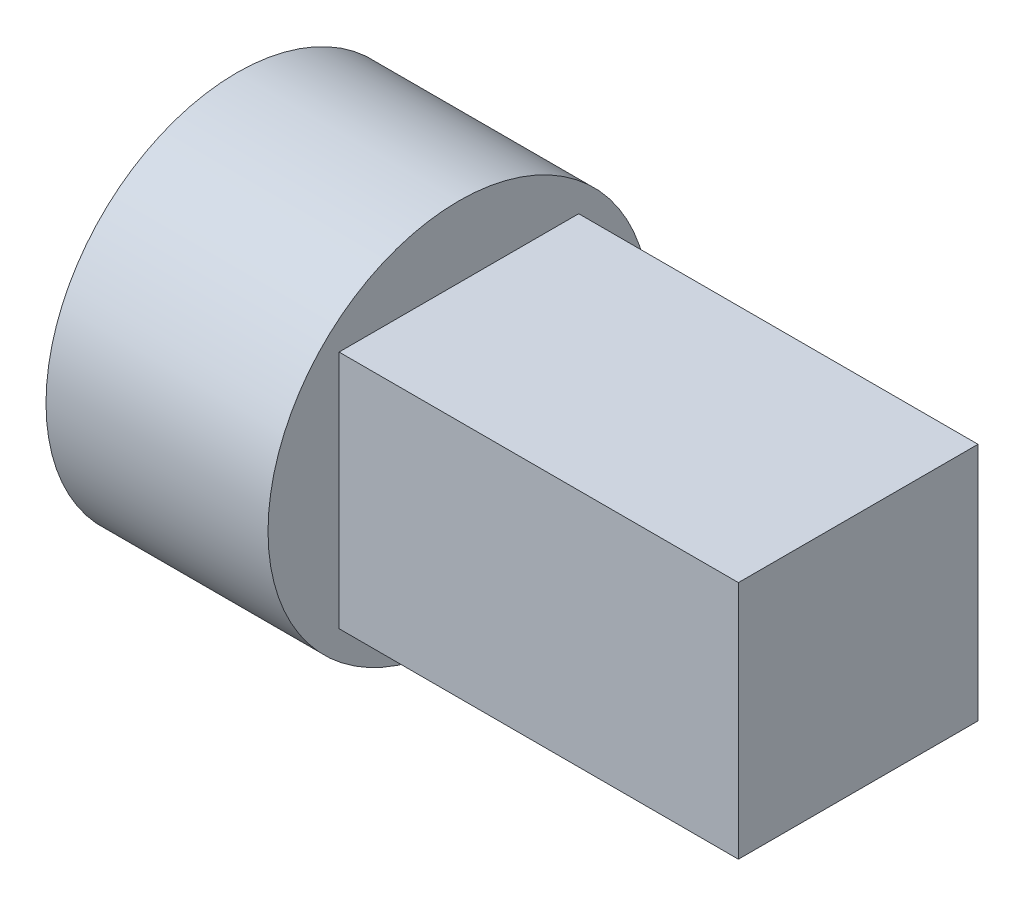
ISO-10303-21;
HEADER;
FILE_DESCRIPTION(('STEP AP214'),'2;1');
FILE_NAME('part.step','',(''),(''),'','','');
FILE_SCHEMA(('AUTOMOTIVE_DESIGN { 1 0 10303 214 1 1 1 1 }'));
ENDSEC;
DATA;
#1=APPLICATION_CONTEXT('core data for automotive mechanical design processes');
#2=APPLICATION_PROTOCOL_DEFINITION('international standard','automotive_design',2000,#1);
#3=PRODUCT_CONTEXT('',#1,'mechanical');
#4=PRODUCT('Part','Part','',(#3));
#5=PRODUCT_RELATED_PRODUCT_CATEGORY('part','',(#4));
#6=PRODUCT_DEFINITION_FORMATION('','',#4);
#7=PRODUCT_DEFINITION_CONTEXT('part definition',#1,'design');
#8=PRODUCT_DEFINITION('design','',#6,#7);
#9=PRODUCT_DEFINITION_SHAPE('','',#8);
#10=(LENGTH_UNIT() NAMED_UNIT(*) SI_UNIT(.MILLI.,.METRE.));
#11=(NAMED_UNIT(*) PLANE_ANGLE_UNIT() SI_UNIT($,.RADIAN.));
#12=(NAMED_UNIT(*) SI_UNIT($,.STERADIAN.) SOLID_ANGLE_UNIT());
#13=UNCERTAINTY_MEASURE_WITH_UNIT(LENGTH_MEASURE(1.E-05),#10,'distance_accuracy_value','');
#14=(GEOMETRIC_REPRESENTATION_CONTEXT(3) GLOBAL_UNCERTAINTY_ASSIGNED_CONTEXT((#13)) GLOBAL_UNIT_ASSIGNED_CONTEXT((#10,
#11,#12)) REPRESENTATION_CONTEXT('',''));
#15=CARTESIAN_POINT('',(0.,0.,0.));
#16=DIRECTION('',(0.,0.,1.));
#17=DIRECTION('',(1.,0.,0.));
#18=AXIS2_PLACEMENT_3D('',#15,#16,#17);
#19=CARTESIAN_POINT('',(2.78,0.,0.));
#20=DIRECTION('',(-1.,0.,0.));
#21=DIRECTION('',(0.,0.,1.));
#22=AXIS2_PLACEMENT_3D('',#19,#20,#21);
#23=CYLINDRICAL_SURFACE('',#22,4.78);
#24=CARTESIAN_POINT('',(2.78,0.,0.));
#25=DIRECTION('',(1.,0.,0.));
#26=DIRECTION('',(0.,0.,-1.));
#27=AXIS2_PLACEMENT_3D('',#24,#25,#26);
#28=CIRCLE('',#27,4.78);
#29=CARTESIAN_POINT('',(2.78,0.,-4.78));
#30=VERTEX_POINT('',#29);
#31=EDGE_CURVE('E11',#30,#30,#28,.T.);
#32=ORIENTED_EDGE('',*,*,#31,.F.);
#33=EDGE_LOOP('',(#32));
#34=FACE_BOUND('',#33,.T.);
#35=CARTESIAN_POINT('',(-2.78,0.,0.));
#36=DIRECTION('',(1.,0.,0.));
#37=DIRECTION('',(0.,0.,-1.));
#38=AXIS2_PLACEMENT_3D('',#35,#36,#37);
#39=CIRCLE('',#38,4.78);
#40=CARTESIAN_POINT('',(-2.78,0.,-4.78));
#41=VERTEX_POINT('',#40);
#42=EDGE_CURVE('E36',#41,#41,#39,.T.);
#43=ORIENTED_EDGE('',*,*,#42,.T.);
#44=EDGE_LOOP('',(#43));
#45=FACE_BOUND('',#44,.T.);
#46=ADVANCED_FACE('F33',(#34,#45),#23,.T.);
#47=CARTESIAN_POINT('',(2.78,0.,0.));
#48=DIRECTION('',(1.,0.,0.));
#49=DIRECTION('',(0.,0.,-1.));
#50=AXIS2_PLACEMENT_3D('',#47,#48,#49);
#51=PLANE('',#50);
#52=DIRECTION('',(0.,1.,0.));
#53=VECTOR('',#52,1.);
#54=CARTESIAN_POINT('',(2.78,3.,-3.));
#55=LINE('',#54,#53);
#56=CARTESIAN_POINT('',(2.78,-3.,-3.));
#57=VERTEX_POINT('',#56);
#58=CARTESIAN_POINT('',(2.78,3.,-3.));
#59=VERTEX_POINT('',#58);
#60=EDGE_CURVE('E47',#57,#59,#55,.T.);
#61=ORIENTED_EDGE('',*,*,#60,.F.);
#62=DIRECTION('',(0.,0.,-1.));
#63=VECTOR('',#62,1.);
#64=CARTESIAN_POINT('',(2.78,-3.,3.));
#65=LINE('',#64,#63);
#66=CARTESIAN_POINT('',(2.78,-3.,3.));
#67=VERTEX_POINT('',#66);
#68=EDGE_CURVE('E51',#67,#57,#65,.T.);
#69=ORIENTED_EDGE('',*,*,#68,.F.);
#70=DIRECTION('',(0.,-1.,0.));
#71=VECTOR('',#70,1.);
#72=CARTESIAN_POINT('',(2.78,3.,3.));
#73=LINE('',#72,#71);
#74=CARTESIAN_POINT('',(2.78,3.,3.));
#75=VERTEX_POINT('',#74);
#76=EDGE_CURVE('E103',#75,#67,#73,.T.);
#77=ORIENTED_EDGE('',*,*,#76,.F.);
#78=DIRECTION('',(0.,0.,1.));
#79=VECTOR('',#78,1.);
#80=CARTESIAN_POINT('',(2.78,3.,3.));
#81=LINE('',#80,#79);
#82=EDGE_CURVE('E105',#59,#75,#81,.T.);
#83=ORIENTED_EDGE('',*,*,#82,.F.);
#84=EDGE_LOOP('',(#61,#69,#77,#83));
#85=FACE_BOUND('',#84,.T.);
#86=ORIENTED_EDGE('',*,*,#31,.T.);
#87=EDGE_LOOP('',(#86));
#88=FACE_BOUND('',#87,.T.);
#89=ADVANCED_FACE('F123',(#85,#88),#51,.T.);
#90=CARTESIAN_POINT('',(-2.78,0.,0.));
#91=DIRECTION('',(1.,0.,0.));
#92=DIRECTION('',(0.,0.,-1.));
#93=AXIS2_PLACEMENT_3D('',#90,#91,#92);
#94=PLANE('',#93);
#95=ORIENTED_EDGE('',*,*,#42,.F.);
#96=EDGE_LOOP('',(#95));
#97=FACE_BOUND('',#96,.T.);
#98=ADVANCED_FACE('F128',(#97),#94,.F.);
#99=CARTESIAN_POINT('',(12.78,3.,-3.));
#100=DIRECTION('',(0.,0.,1.));
#101=DIRECTION('',(0.,-1.,0.));
#102=AXIS2_PLACEMENT_3D('',#99,#100,#101);
#103=PLANE('',#102);
#104=ORIENTED_EDGE('',*,*,#60,.T.);
#105=DIRECTION('',(-1.,0.,0.));
#106=VECTOR('',#105,1.);
#107=CARTESIAN_POINT('',(12.78,3.,-3.));
#108=LINE('',#107,#106);
#109=CARTESIAN_POINT('',(12.78,3.,-3.));
#110=VERTEX_POINT('',#109);
#111=EDGE_CURVE('E76',#110,#59,#108,.T.);
#112=ORIENTED_EDGE('',*,*,#111,.F.);
#113=DIRECTION('',(0.,1.,0.));
#114=VECTOR('',#113,1.);
#115=CARTESIAN_POINT('',(12.78,3.,-3.));
#116=LINE('',#115,#114);
#117=CARTESIAN_POINT('',(12.78,-3.,-3.));
#118=VERTEX_POINT('',#117);
#119=EDGE_CURVE('E82',#118,#110,#116,.T.);
#120=ORIENTED_EDGE('',*,*,#119,.F.);
#121=DIRECTION('',(-1.,0.,0.));
#122=VECTOR('',#121,1.);
#123=CARTESIAN_POINT('',(12.78,-3.,-3.));
#124=LINE('',#123,#122);
#125=EDGE_CURVE('E100',#118,#57,#124,.T.);
#126=ORIENTED_EDGE('',*,*,#125,.T.);
#127=EDGE_LOOP('',(#104,#112,#120,#126));
#128=FACE_BOUND('',#127,.T.);
#129=ADVANCED_FACE('F92',(#128),#103,.F.);
#130=CARTESIAN_POINT('',(12.78,3.,3.));
#131=DIRECTION('',(0.,-1.,0.));
#132=DIRECTION('',(0.,0.,-1.));
#133=AXIS2_PLACEMENT_3D('',#130,#131,#132);
#134=PLANE('',#133);
#135=ORIENTED_EDGE('',*,*,#82,.T.);
#136=DIRECTION('',(-1.,0.,0.));
#137=VECTOR('',#136,1.);
#138=CARTESIAN_POINT('',(12.78,3.,3.));
#139=LINE('',#138,#137);
#140=CARTESIAN_POINT('',(12.78,3.,3.));
#141=VERTEX_POINT('',#140);
#142=EDGE_CURVE('E78',#141,#75,#139,.T.);
#143=ORIENTED_EDGE('',*,*,#142,.F.);
#144=DIRECTION('',(0.,0.,1.));
#145=VECTOR('',#144,1.);
#146=CARTESIAN_POINT('',(12.78,3.,3.));
#147=LINE('',#146,#145);
#148=EDGE_CURVE('E71',#110,#141,#147,.T.);
#149=ORIENTED_EDGE('',*,*,#148,.F.);
#150=ORIENTED_EDGE('',*,*,#111,.T.);
#151=EDGE_LOOP('',(#135,#143,#149,#150));
#152=FACE_BOUND('',#151,.T.);
#153=ADVANCED_FACE('F74',(#152),#134,.F.);
#154=CARTESIAN_POINT('',(12.78,3.,3.));
#155=DIRECTION('',(0.,0.,-1.));
#156=DIRECTION('',(0.,1.,0.));
#157=AXIS2_PLACEMENT_3D('',#154,#155,#156);
#158=PLANE('',#157);
#159=ORIENTED_EDGE('',*,*,#76,.T.);
#160=DIRECTION('',(-1.,0.,0.));
#161=VECTOR('',#160,1.);
#162=CARTESIAN_POINT('',(12.78,-3.,3.));
#163=LINE('',#162,#161);
#164=CARTESIAN_POINT('',(12.78,-3.,3.));
#165=VERTEX_POINT('',#164);
#166=EDGE_CURVE('E95',#165,#67,#163,.T.);
#167=ORIENTED_EDGE('',*,*,#166,.F.);
#168=DIRECTION('',(0.,-1.,0.));
#169=VECTOR('',#168,1.);
#170=CARTESIAN_POINT('',(12.78,3.,3.));
#171=LINE('',#170,#169);
#172=EDGE_CURVE('E81',#141,#165,#171,.T.);
#173=ORIENTED_EDGE('',*,*,#172,.F.);
#174=ORIENTED_EDGE('',*,*,#142,.T.);
#175=EDGE_LOOP('',(#159,#167,#173,#174));
#176=FACE_BOUND('',#175,.T.);
#177=ADVANCED_FACE('F111',(#176),#158,.F.);
#178=CARTESIAN_POINT('',(12.78,-3.,3.));
#179=DIRECTION('',(0.,1.,0.));
#180=DIRECTION('',(0.,0.,1.));
#181=AXIS2_PLACEMENT_3D('',#178,#179,#180);
#182=PLANE('',#181);
#183=ORIENTED_EDGE('',*,*,#68,.T.);
#184=ORIENTED_EDGE('',*,*,#125,.F.);
#185=DIRECTION('',(0.,0.,-1.));
#186=VECTOR('',#185,1.);
#187=CARTESIAN_POINT('',(12.78,-3.,3.));
#188=LINE('',#187,#186);
#189=EDGE_CURVE('E87',#165,#118,#188,.T.);
#190=ORIENTED_EDGE('',*,*,#189,.F.);
#191=ORIENTED_EDGE('',*,*,#166,.T.);
#192=EDGE_LOOP('',(#183,#184,#190,#191));
#193=FACE_BOUND('',#192,.T.);
#194=ADVANCED_FACE('F113',(#193),#182,.F.);
#195=CARTESIAN_POINT('',(12.78,0.,0.));
#196=DIRECTION('',(1.,0.,0.));
#197=DIRECTION('',(0.,0.,-1.));
#198=AXIS2_PLACEMENT_3D('',#195,#196,#197);
#199=PLANE('',#198);
#200=ORIENTED_EDGE('',*,*,#119,.T.);
#201=ORIENTED_EDGE('',*,*,#148,.T.);
#202=ORIENTED_EDGE('',*,*,#172,.T.);
#203=ORIENTED_EDGE('',*,*,#189,.T.);
#204=EDGE_LOOP('',(#200,#201,#202,#203));
#205=FACE_BOUND('',#204,.T.);
#206=ADVANCED_FACE('F85',(#205),#199,.T.);
#207=CLOSED_SHELL('',(#46,#89,#98,#129,#153,#177,#194,#206));
#208=MANIFOLD_SOLID_BREP('B2',#207);
#209=ADVANCED_BREP_SHAPE_REPRESENTATION('',(#18,#208),#14);
#210=SHAPE_DEFINITION_REPRESENTATION(#9,#209);
ENDSEC;
END-ISO-10303-21;
